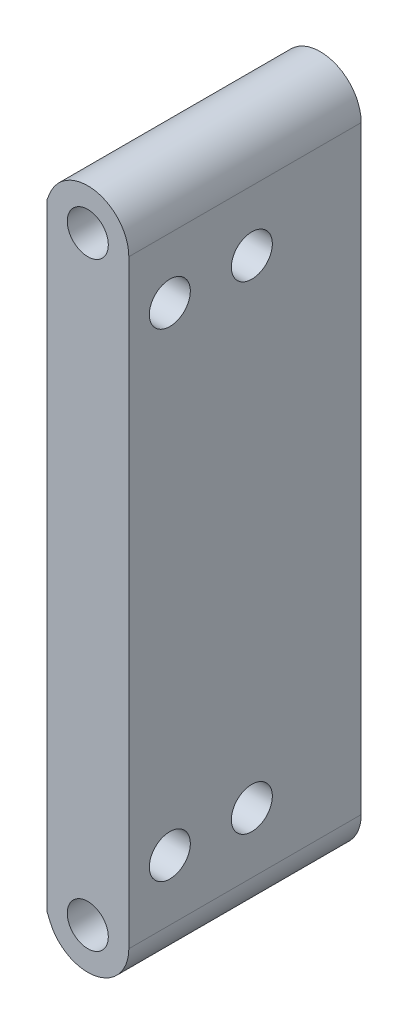
ISO-10303-21;
HEADER;
FILE_DESCRIPTION(('STEP AP214'),'2;1');
FILE_NAME('part.step','',(''),(''),'','','');
FILE_SCHEMA(('AUTOMOTIVE_DESIGN { 1 0 10303 214 1 1 1 1 }'));
ENDSEC;
DATA;
#1=APPLICATION_CONTEXT('core data for automotive mechanical design processes');
#2=APPLICATION_PROTOCOL_DEFINITION('international standard','automotive_design',2000,#1);
#3=PRODUCT_CONTEXT('',#1,'mechanical');
#4=PRODUCT('Part','Part','',(#3));
#5=PRODUCT_RELATED_PRODUCT_CATEGORY('part','',(#4));
#6=PRODUCT_DEFINITION_FORMATION('','',#4);
#7=PRODUCT_DEFINITION_CONTEXT('part definition',#1,'design');
#8=PRODUCT_DEFINITION('design','',#6,#7);
#9=PRODUCT_DEFINITION_SHAPE('','',#8);
#10=(LENGTH_UNIT() NAMED_UNIT(*) SI_UNIT(.MILLI.,.METRE.));
#11=(NAMED_UNIT(*) PLANE_ANGLE_UNIT() SI_UNIT($,.RADIAN.));
#12=(NAMED_UNIT(*) SI_UNIT($,.STERADIAN.) SOLID_ANGLE_UNIT());
#13=UNCERTAINTY_MEASURE_WITH_UNIT(LENGTH_MEASURE(1.E-05),#10,'distance_accuracy_value','');
#14=(GEOMETRIC_REPRESENTATION_CONTEXT(3) GLOBAL_UNCERTAINTY_ASSIGNED_CONTEXT((#13)) GLOBAL_UNIT_ASSIGNED_CONTEXT((#10,
#11,#12)) REPRESENTATION_CONTEXT('',''));
#15=CARTESIAN_POINT('',(0.,0.,0.));
#16=DIRECTION('',(0.,0.,1.));
#17=DIRECTION('',(1.,0.,0.));
#18=AXIS2_PLACEMENT_3D('',#15,#16,#17);
#19=CARTESIAN_POINT('',(-21.920310216783,21.920310216783,17.));
#20=DIRECTION('',(0.,0.,-1.));
#21=DIRECTION('',(-1.,0.,0.));
#22=AXIS2_PLACEMENT_3D('',#19,#20,#21);
#23=PLANE('',#22);
#24=DIRECTION('',(-0.38268343236509,-0.923879532511287,0.));
#25=VECTOR('',#24,1.);
#26=CARTESIAN_POINT('',(-24.6919488143168,23.0683605138782,17.));
#27=LINE('',#26,#25);
#28=CARTESIAN_POINT('',(-24.6919488143168,23.0683605138782,17.));
#29=VERTEX_POINT('',#28);
#30=CARTESIAN_POINT('',(-24.920310216783,22.517047318922,17.));
#31=VERTEX_POINT('',#30);
#32=EDGE_CURVE('E98',#29,#31,#27,.T.);
#33=ORIENTED_EDGE('',*,*,#32,.T.);
#34=DIRECTION('',(0.,1.,0.));
#35=VECTOR('',#34,1.);
#36=CARTESIAN_POINT('',(-24.920310216783,22.517047318922,17.));
#37=LINE('',#36,#35);
#38=CARTESIAN_POINT('',(-24.920310216783,-22.517047318922,17.));
#39=VERTEX_POINT('',#38);
#40=EDGE_CURVE('E116',#39,#31,#37,.T.);
#41=ORIENTED_EDGE('',*,*,#40,.F.);
#42=DIRECTION('',(0.38268343236509,-0.923879532511287,0.));
#43=VECTOR('',#42,1.);
#44=CARTESIAN_POINT('',(-24.6919488143168,-23.0683605138782,17.));
#45=LINE('',#44,#43);
#46=CARTESIAN_POINT('',(-24.6919488143168,-23.0683605138782,17.));
#47=VERTEX_POINT('',#46);
#48=EDGE_CURVE('E152',#39,#47,#45,.T.);
#49=ORIENTED_EDGE('',*,*,#48,.T.);
#50=CARTESIAN_POINT('',(-21.920310216783,-21.920310216783,17.));
#51=DIRECTION('',(0.,0.,1.));
#52=DIRECTION('',(1.,0.,0.));
#53=AXIS2_PLACEMENT_3D('',#50,#51,#52);
#54=CIRCLE('',#53,3.);
#55=CARTESIAN_POINT('',(-18.920310216783,-21.920310216783,17.));
#56=VERTEX_POINT('',#55);
#57=EDGE_CURVE('E156',#47,#56,#54,.T.);
#58=ORIENTED_EDGE('',*,*,#57,.T.);
#59=DIRECTION('',(0.,1.,0.));
#60=VECTOR('',#59,1.);
#61=CARTESIAN_POINT('',(-18.920310216783,-21.920310216783,17.));
#62=LINE('',#61,#60);
#63=CARTESIAN_POINT('',(-18.920310216783,21.920310216783,17.));
#64=VERTEX_POINT('',#63);
#65=EDGE_CURVE('E64',#56,#64,#62,.T.);
#66=ORIENTED_EDGE('',*,*,#65,.T.);
#67=CARTESIAN_POINT('',(-21.920310216783,21.920310216783,17.));
#68=DIRECTION('',(0.,0.,1.));
#69=DIRECTION('',(-1.,0.,0.));
#70=AXIS2_PLACEMENT_3D('',#67,#68,#69);
#71=CIRCLE('',#70,3.);
#72=EDGE_CURVE('E151',#64,#29,#71,.T.);
#73=ORIENTED_EDGE('',*,*,#72,.T.);
#74=EDGE_LOOP('',(#33,#41,#49,#58,#66,#73));
#75=FACE_BOUND('',#74,.T.);
#76=CARTESIAN_POINT('',(-21.920310216783,21.920310216783,17.));
#77=DIRECTION('',(0.,0.,1.));
#78=DIRECTION('',(1.,0.,0.));
#79=AXIS2_PLACEMENT_3D('',#76,#77,#78);
#80=CIRCLE('',#79,1.5);
#81=CARTESIAN_POINT('',(-20.420310216783,21.920310216783,17.));
#82=VERTEX_POINT('',#81);
#83=EDGE_CURVE('E142',#82,#82,#80,.T.);
#84=ORIENTED_EDGE('',*,*,#83,.F.);
#85=EDGE_LOOP('',(#84));
#86=FACE_BOUND('',#85,.T.);
#87=CARTESIAN_POINT('',(-21.920310216783,-21.920310216783,17.));
#88=DIRECTION('',(0.,0.,1.));
#89=DIRECTION('',(1.,0.,0.));
#90=AXIS2_PLACEMENT_3D('',#87,#88,#89);
#91=CIRCLE('',#90,1.5);
#92=CARTESIAN_POINT('',(-20.420310216783,-21.920310216783,17.));
#93=VERTEX_POINT('',#92);
#94=EDGE_CURVE('E134',#93,#93,#91,.T.);
#95=ORIENTED_EDGE('',*,*,#94,.F.);
#96=EDGE_LOOP('',(#95));
#97=FACE_BOUND('',#96,.T.);
#98=ADVANCED_FACE('F39',(#75,#86,#97),#23,.F.);
#99=CARTESIAN_POINT('',(-21.920310216783,21.920310216783,0.));
#100=DIRECTION('',(0.,0.,-1.));
#101=DIRECTION('',(-1.,0.,0.));
#102=AXIS2_PLACEMENT_3D('',#99,#100,#101);
#103=PLANE('',#102);
#104=CARTESIAN_POINT('',(-21.920310216783,21.920310216783,0.));
#105=DIRECTION('',(0.,0.,1.));
#106=DIRECTION('',(1.,0.,0.));
#107=AXIS2_PLACEMENT_3D('',#104,#105,#106);
#108=CIRCLE('',#107,1.5);
#109=CARTESIAN_POINT('',(-20.420310216783,21.920310216783,0.));
#110=VERTEX_POINT('',#109);
#111=EDGE_CURVE('E136',#110,#110,#108,.T.);
#112=ORIENTED_EDGE('',*,*,#111,.T.);
#113=EDGE_LOOP('',(#112));
#114=FACE_BOUND('',#113,.T.);
#115=CARTESIAN_POINT('',(-21.920310216783,21.920310216783,0.));
#116=DIRECTION('',(0.,0.,1.));
#117=DIRECTION('',(-1.,0.,0.));
#118=AXIS2_PLACEMENT_3D('',#115,#116,#117);
#119=CIRCLE('',#118,3.);
#120=CARTESIAN_POINT('',(-18.920310216783,21.920310216783,0.));
#121=VERTEX_POINT('',#120);
#122=CARTESIAN_POINT('',(-24.6919488143168,23.0683605138782,0.));
#123=VERTEX_POINT('',#122);
#124=EDGE_CURVE('E147',#121,#123,#119,.T.);
#125=ORIENTED_EDGE('',*,*,#124,.F.);
#126=DIRECTION('',(0.,1.,0.));
#127=VECTOR('',#126,1.);
#128=CARTESIAN_POINT('',(-18.920310216783,-21.920310216783,0.));
#129=LINE('',#128,#127);
#130=CARTESIAN_POINT('',(-18.920310216783,-21.920310216783,0.));
#131=VERTEX_POINT('',#130);
#132=EDGE_CURVE('E93',#131,#121,#129,.T.);
#133=ORIENTED_EDGE('',*,*,#132,.F.);
#134=CARTESIAN_POINT('',(-21.920310216783,-21.920310216783,0.));
#135=DIRECTION('',(0.,0.,1.));
#136=DIRECTION('',(1.,0.,0.));
#137=AXIS2_PLACEMENT_3D('',#134,#135,#136);
#138=CIRCLE('',#137,3.);
#139=CARTESIAN_POINT('',(-24.6919488143168,-23.0683605138782,0.));
#140=VERTEX_POINT('',#139);
#141=EDGE_CURVE('E166',#140,#131,#138,.T.);
#142=ORIENTED_EDGE('',*,*,#141,.F.);
#143=DIRECTION('',(0.38268343236509,-0.923879532511287,0.));
#144=VECTOR('',#143,1.);
#145=CARTESIAN_POINT('',(-24.6919488143168,-23.0683605138782,0.));
#146=LINE('',#145,#144);
#147=CARTESIAN_POINT('',(-33.7716385975339,-1.14805029709527,0.));
#148=VERTEX_POINT('',#147);
#149=EDGE_CURVE('E170',#148,#140,#146,.T.);
#150=ORIENTED_EDGE('',*,*,#149,.F.);
#151=CARTESIAN_POINT('',(-31.,0.,0.));
#152=DIRECTION('',(0.,0.,1.));
#153=DIRECTION('',(1.,0.,0.));
#154=AXIS2_PLACEMENT_3D('',#151,#152,#153);
#155=CIRCLE('',#154,3.);
#156=CARTESIAN_POINT('',(-33.7716385975339,1.14805029709527,0.));
#157=VERTEX_POINT('',#156);
#158=EDGE_CURVE('E163',#157,#148,#155,.T.);
#159=ORIENTED_EDGE('',*,*,#158,.F.);
#160=DIRECTION('',(-0.38268343236509,-0.923879532511287,0.));
#161=VECTOR('',#160,1.);
#162=CARTESIAN_POINT('',(-24.6919488143168,23.0683605138782,0.));
#163=LINE('',#162,#161);
#164=EDGE_CURVE('E165',#123,#157,#163,.T.);
#165=ORIENTED_EDGE('',*,*,#164,.F.);
#166=EDGE_LOOP('',(#125,#133,#142,#150,#159,#165));
#167=FACE_BOUND('',#166,.T.);
#168=CARTESIAN_POINT('',(-31.,0.,0.));
#169=DIRECTION('',(0.,0.,1.));
#170=DIRECTION('',(1.,0.,0.));
#171=AXIS2_PLACEMENT_3D('',#168,#169,#170);
#172=CIRCLE('',#171,1.5);
#173=CARTESIAN_POINT('',(-29.5,0.,0.));
#174=VERTEX_POINT('',#173);
#175=EDGE_CURVE('E144',#174,#174,#172,.T.);
#176=ORIENTED_EDGE('',*,*,#175,.T.);
#177=EDGE_LOOP('',(#176));
#178=FACE_BOUND('',#177,.T.);
#179=CARTESIAN_POINT('',(-21.920310216783,-21.920310216783,0.));
#180=DIRECTION('',(0.,0.,1.));
#181=DIRECTION('',(1.,0.,0.));
#182=AXIS2_PLACEMENT_3D('',#179,#180,#181);
#183=CIRCLE('',#182,1.5);
#184=CARTESIAN_POINT('',(-20.420310216783,-21.920310216783,0.));
#185=VERTEX_POINT('',#184);
#186=EDGE_CURVE('E132',#185,#185,#183,.T.);
#187=ORIENTED_EDGE('',*,*,#186,.T.);
#188=EDGE_LOOP('',(#187));
#189=FACE_BOUND('',#188,.T.);
#190=ADVANCED_FACE('F188',(#114,#167,#178,#189),#103,.T.);
#191=CARTESIAN_POINT('',(-21.920310216783,21.920310216783,17.));
#192=DIRECTION('',(0.,0.,-1.));
#193=DIRECTION('',(-1.,0.,0.));
#194=AXIS2_PLACEMENT_3D('',#191,#192,#193);
#195=CYLINDRICAL_SURFACE('',#194,3.);
#196=ORIENTED_EDGE('',*,*,#124,.T.);
#197=DIRECTION('',(0.,0.,-1.));
#198=VECTOR('',#197,1.);
#199=CARTESIAN_POINT('',(-24.6919488143168,23.0683605138782,17.));
#200=LINE('',#199,#198);
#201=EDGE_CURVE('E11',#29,#123,#200,.T.);
#202=ORIENTED_EDGE('',*,*,#201,.F.);
#203=ORIENTED_EDGE('',*,*,#72,.F.);
#204=DIRECTION('',(0.,0.,-1.));
#205=VECTOR('',#204,1.);
#206=CARTESIAN_POINT('',(-18.920310216783,21.920310216783,17.));
#207=LINE('',#206,#205);
#208=EDGE_CURVE('E157',#64,#121,#207,.T.);
#209=ORIENTED_EDGE('',*,*,#208,.T.);
#210=EDGE_LOOP('',(#196,#202,#203,#209));
#211=FACE_BOUND('',#210,.T.);
#212=ADVANCED_FACE('F41',(#211),#195,.T.);
#213=CARTESIAN_POINT('',(-24.6919488143168,23.0683605138782,17.));
#214=DIRECTION('',(0.923879532511287,-0.38268343236509,0.));
#215=DIRECTION('',(0.38268343236509,0.923879532511287,0.));
#216=AXIS2_PLACEMENT_3D('',#213,#214,#215);
#217=PLANE('',#216);
#218=DIRECTION('',(0.38268343236509,0.923879532511287,0.));
#219=VECTOR('',#218,1.);
#220=CARTESIAN_POINT('',(-24.6919488143168,23.0683605138782,5.));
#221=LINE('',#220,#219);
#222=CARTESIAN_POINT('',(-33.7716385975339,1.14805029709527,5.));
#223=VERTEX_POINT('',#222);
#224=CARTESIAN_POINT('',(-24.920310216783,22.517047318922,5.));
#225=VERTEX_POINT('',#224);
#226=EDGE_CURVE('E121',#223,#225,#221,.T.);
#227=ORIENTED_EDGE('',*,*,#226,.T.);
#228=DIRECTION('',(0.,0.,1.));
#229=VECTOR('',#228,1.);
#230=CARTESIAN_POINT('',(-24.920310216783,22.517047318922,5.));
#231=LINE('',#230,#229);
#232=EDGE_CURVE('E111',#225,#31,#231,.T.);
#233=ORIENTED_EDGE('',*,*,#232,.T.);
#234=ORIENTED_EDGE('',*,*,#32,.F.);
#235=ORIENTED_EDGE('',*,*,#201,.T.);
#236=ORIENTED_EDGE('',*,*,#164,.T.);
#237=DIRECTION('',(0.,0.,-1.));
#238=VECTOR('',#237,1.);
#239=CARTESIAN_POINT('',(-33.7716385975339,1.14805029709527,17.));
#240=LINE('',#239,#238);
#241=EDGE_CURVE('E48',#223,#157,#240,.T.);
#242=ORIENTED_EDGE('',*,*,#241,.F.);
#243=EDGE_LOOP('',(#227,#233,#234,#235,#236,#242));
#244=FACE_BOUND('',#243,.T.);
#245=ADVANCED_FACE('F129',(#244),#217,.F.);
#246=CARTESIAN_POINT('',(-31.,0.,17.));
#247=DIRECTION('',(0.,0.,-1.));
#248=DIRECTION('',(-1.,0.,0.));
#249=AXIS2_PLACEMENT_3D('',#246,#247,#248);
#250=CYLINDRICAL_SURFACE('',#249,3.);
#251=DIRECTION('',(0.,0.,-1.));
#252=VECTOR('',#251,1.);
#253=CARTESIAN_POINT('',(-33.7716385975339,-1.14805029709527,17.));
#254=LINE('',#253,#252);
#255=CARTESIAN_POINT('',(-33.7716385975339,-1.14805029709527,5.));
#256=VERTEX_POINT('',#255);
#257=EDGE_CURVE('E178',#256,#148,#254,.T.);
#258=ORIENTED_EDGE('',*,*,#257,.F.);
#259=CARTESIAN_POINT('',(-31.,0.,5.));
#260=DIRECTION('',(0.,0.,-1.));
#261=DIRECTION('',(-1.,0.,0.));
#262=AXIS2_PLACEMENT_3D('',#259,#260,#261);
#263=CIRCLE('',#262,3.);
#264=EDGE_CURVE('E54',#256,#223,#263,.T.);
#265=ORIENTED_EDGE('',*,*,#264,.T.);
#266=ORIENTED_EDGE('',*,*,#241,.T.);
#267=ORIENTED_EDGE('',*,*,#158,.T.);
#268=EDGE_LOOP('',(#258,#265,#266,#267));
#269=FACE_BOUND('',#268,.T.);
#270=ADVANCED_FACE('F185',(#269),#250,.T.);
#271=CARTESIAN_POINT('',(-24.6919488143168,-23.0683605138782,17.));
#272=DIRECTION('',(0.923879532511287,0.38268343236509,0.));
#273=DIRECTION('',(-0.38268343236509,0.923879532511287,0.));
#274=AXIS2_PLACEMENT_3D('',#271,#272,#273);
#275=PLANE('',#274);
#276=ORIENTED_EDGE('',*,*,#48,.F.);
#277=DIRECTION('',(0.,0.,1.));
#278=VECTOR('',#277,1.);
#279=CARTESIAN_POINT('',(-24.920310216783,-22.517047318922,5.));
#280=LINE('',#279,#278);
#281=CARTESIAN_POINT('',(-24.920310216783,-22.517047318922,5.));
#282=VERTEX_POINT('',#281);
#283=EDGE_CURVE('E125',#282,#39,#280,.T.);
#284=ORIENTED_EDGE('',*,*,#283,.F.);
#285=DIRECTION('',(-0.38268343236509,0.923879532511287,0.));
#286=VECTOR('',#285,1.);
#287=CARTESIAN_POINT('',(-24.6919488143168,-23.0683605138782,5.));
#288=LINE('',#287,#286);
#289=EDGE_CURVE('E127',#282,#256,#288,.T.);
#290=ORIENTED_EDGE('',*,*,#289,.T.);
#291=ORIENTED_EDGE('',*,*,#257,.T.);
#292=ORIENTED_EDGE('',*,*,#149,.T.);
#293=DIRECTION('',(0.,0.,-1.));
#294=VECTOR('',#293,1.);
#295=CARTESIAN_POINT('',(-24.6919488143168,-23.0683605138782,17.));
#296=LINE('',#295,#294);
#297=EDGE_CURVE('E171',#47,#140,#296,.T.);
#298=ORIENTED_EDGE('',*,*,#297,.F.);
#299=EDGE_LOOP('',(#276,#284,#290,#291,#292,#298));
#300=FACE_BOUND('',#299,.T.);
#301=ADVANCED_FACE('F194',(#300),#275,.F.);
#302=CARTESIAN_POINT('',(-21.920310216783,-21.920310216783,17.));
#303=DIRECTION('',(0.,0.,-1.));
#304=DIRECTION('',(-1.,0.,0.));
#305=AXIS2_PLACEMENT_3D('',#302,#303,#304);
#306=CYLINDRICAL_SURFACE('',#305,3.);
#307=ORIENTED_EDGE('',*,*,#141,.T.);
#308=DIRECTION('',(0.,0.,-1.));
#309=VECTOR('',#308,1.);
#310=CARTESIAN_POINT('',(-18.920310216783,-21.920310216783,17.));
#311=LINE('',#310,#309);
#312=EDGE_CURVE('E173',#56,#131,#311,.T.);
#313=ORIENTED_EDGE('',*,*,#312,.F.);
#314=ORIENTED_EDGE('',*,*,#57,.F.);
#315=ORIENTED_EDGE('',*,*,#297,.T.);
#316=EDGE_LOOP('',(#307,#313,#314,#315));
#317=FACE_BOUND('',#316,.T.);
#318=ADVANCED_FACE('F197',(#317),#306,.T.);
#319=CARTESIAN_POINT('',(-18.920310216783,-21.920310216783,17.));
#320=DIRECTION('',(-1.,0.,0.));
#321=DIRECTION('',(0.,0.,1.));
#322=AXIS2_PLACEMENT_3D('',#319,#320,#321);
#323=PLANE('',#322);
#324=CARTESIAN_POINT('',(-18.920310216783,-17.5,8.00000000000001));
#325=DIRECTION('',(-1.,0.,0.));
#326=DIRECTION('',(0.,1.,0.));
#327=AXIS2_PLACEMENT_3D('',#324,#325,#326);
#328=CIRCLE('',#327,1.5);
#329=CARTESIAN_POINT('',(-18.920310216783,-16.,8.00000000000001));
#330=VERTEX_POINT('',#329);
#331=EDGE_CURVE('E212',#330,#330,#328,.T.);
#332=ORIENTED_EDGE('',*,*,#331,.T.);
#333=EDGE_LOOP('',(#332));
#334=FACE_BOUND('',#333,.T.);
#335=CARTESIAN_POINT('',(-18.920310216783,-17.5,14.));
#336=DIRECTION('',(-1.,0.,0.));
#337=DIRECTION('',(0.,-1.,0.));
#338=AXIS2_PLACEMENT_3D('',#335,#336,#337);
#339=CIRCLE('',#338,1.5);
#340=CARTESIAN_POINT('',(-18.920310216783,-19.,14.));
#341=VERTEX_POINT('',#340);
#342=EDGE_CURVE('E219',#341,#341,#339,.T.);
#343=ORIENTED_EDGE('',*,*,#342,.T.);
#344=EDGE_LOOP('',(#343));
#345=FACE_BOUND('',#344,.T.);
#346=CARTESIAN_POINT('',(-18.920310216783,17.5,14.));
#347=DIRECTION('',(-1.,0.,0.));
#348=DIRECTION('',(0.,1.,0.));
#349=AXIS2_PLACEMENT_3D('',#346,#347,#348);
#350=CIRCLE('',#349,1.5);
#351=CARTESIAN_POINT('',(-18.920310216783,19.,14.));
#352=VERTEX_POINT('',#351);
#353=EDGE_CURVE('E208',#352,#352,#350,.T.);
#354=ORIENTED_EDGE('',*,*,#353,.T.);
#355=EDGE_LOOP('',(#354));
#356=FACE_BOUND('',#355,.T.);
#357=CARTESIAN_POINT('',(-18.920310216783,17.5,8.));
#358=DIRECTION('',(-1.,0.,0.));
#359=DIRECTION('',(0.,-1.,0.));
#360=AXIS2_PLACEMENT_3D('',#357,#358,#359);
#361=CIRCLE('',#360,1.5);
#362=CARTESIAN_POINT('',(-18.920310216783,16.,8.));
#363=VERTEX_POINT('',#362);
#364=EDGE_CURVE('E201',#363,#363,#361,.T.);
#365=ORIENTED_EDGE('',*,*,#364,.T.);
#366=EDGE_LOOP('',(#365));
#367=FACE_BOUND('',#366,.T.);
#368=ORIENTED_EDGE('',*,*,#132,.T.);
#369=ORIENTED_EDGE('',*,*,#208,.F.);
#370=ORIENTED_EDGE('',*,*,#65,.F.);
#371=ORIENTED_EDGE('',*,*,#312,.T.);
#372=EDGE_LOOP('',(#368,#369,#370,#371));
#373=FACE_BOUND('',#372,.T.);
#374=ADVANCED_FACE('F229',(#334,#345,#356,#367,#373),#323,.F.);
#375=CARTESIAN_POINT('',(-31.,0.,17.));
#376=DIRECTION('',(0.,0.,-1.));
#377=DIRECTION('',(-1.,0.,0.));
#378=AXIS2_PLACEMENT_3D('',#375,#376,#377);
#379=CYLINDRICAL_SURFACE('',#378,1.5);
#380=CARTESIAN_POINT('',(-31.,0.,5.));
#381=DIRECTION('',(0.,0.,-1.));
#382=DIRECTION('',(-1.,0.,0.));
#383=AXIS2_PLACEMENT_3D('',#380,#381,#382);
#384=CIRCLE('',#383,1.5);
#385=CARTESIAN_POINT('',(-32.5,0.,5.));
#386=VERTEX_POINT('',#385);
#387=EDGE_CURVE('E43',#386,#386,#384,.T.);
#388=ORIENTED_EDGE('',*,*,#387,.F.);
#389=EDGE_LOOP('',(#388));
#390=FACE_BOUND('',#389,.T.);
#391=ORIENTED_EDGE('',*,*,#175,.F.);
#392=EDGE_LOOP('',(#391));
#393=FACE_BOUND('',#392,.T.);
#394=ADVANCED_FACE('F262',(#390,#393),#379,.F.);
#395=CARTESIAN_POINT('',(-21.920310216783,21.920310216783,17.));
#396=DIRECTION('',(0.,0.,-1.));
#397=DIRECTION('',(-1.,0.,0.));
#398=AXIS2_PLACEMENT_3D('',#395,#396,#397);
#399=CYLINDRICAL_SURFACE('',#398,1.5);
#400=ORIENTED_EDGE('',*,*,#83,.T.);
#401=EDGE_LOOP('',(#400));
#402=FACE_BOUND('',#401,.T.);
#403=ORIENTED_EDGE('',*,*,#111,.F.);
#404=EDGE_LOOP('',(#403));
#405=FACE_BOUND('',#404,.T.);
#406=ADVANCED_FACE('F291',(#402,#405),#399,.F.);
#407=CARTESIAN_POINT('',(-21.920310216783,-21.920310216783,17.));
#408=DIRECTION('',(0.,0.,-1.));
#409=DIRECTION('',(-1.,0.,0.));
#410=AXIS2_PLACEMENT_3D('',#407,#408,#409);
#411=CYLINDRICAL_SURFACE('',#410,1.5);
#412=ORIENTED_EDGE('',*,*,#94,.T.);
#413=EDGE_LOOP('',(#412));
#414=FACE_BOUND('',#413,.T.);
#415=ORIENTED_EDGE('',*,*,#186,.F.);
#416=EDGE_LOOP('',(#415));
#417=FACE_BOUND('',#416,.T.);
#418=ADVANCED_FACE('F297',(#414,#417),#411,.F.);
#419=CARTESIAN_POINT('',(0.,0.,5.));
#420=DIRECTION('',(0.,0.,-1.));
#421=DIRECTION('',(-1.,0.,0.));
#422=AXIS2_PLACEMENT_3D('',#419,#420,#421);
#423=PLANE('',#422);
#424=ORIENTED_EDGE('',*,*,#387,.T.);
#425=EDGE_LOOP('',(#424));
#426=FACE_BOUND('',#425,.T.);
#427=ORIENTED_EDGE('',*,*,#264,.F.);
#428=ORIENTED_EDGE('',*,*,#289,.F.);
#429=DIRECTION('',(0.,1.,0.));
#430=VECTOR('',#429,1.);
#431=CARTESIAN_POINT('',(-24.920310216783,22.517047318922,5.));
#432=LINE('',#431,#430);
#433=EDGE_CURVE('E120',#282,#225,#432,.T.);
#434=ORIENTED_EDGE('',*,*,#433,.T.);
#435=ORIENTED_EDGE('',*,*,#226,.F.);
#436=EDGE_LOOP('',(#427,#428,#434,#435));
#437=FACE_BOUND('',#436,.T.);
#438=ADVANCED_FACE('F124',(#426,#437),#423,.F.);
#439=CARTESIAN_POINT('',(-24.920310216783,22.517047318922,5.));
#440=DIRECTION('',(1.,0.,0.));
#441=DIRECTION('',(0.,1.,0.));
#442=AXIS2_PLACEMENT_3D('',#439,#440,#441);
#443=PLANE('',#442);
#444=CARTESIAN_POINT('',(-24.920310216783,-17.5,8.00000000000001));
#445=DIRECTION('',(-1.,0.,0.));
#446=DIRECTION('',(0.,1.,0.));
#447=AXIS2_PLACEMENT_3D('',#444,#445,#446);
#448=CIRCLE('',#447,1.5);
#449=CARTESIAN_POINT('',(-24.920310216783,-16.,8.00000000000001));
#450=VERTEX_POINT('',#449);
#451=EDGE_CURVE('E211',#450,#450,#448,.T.);
#452=ORIENTED_EDGE('',*,*,#451,.F.);
#453=EDGE_LOOP('',(#452));
#454=FACE_BOUND('',#453,.T.);
#455=CARTESIAN_POINT('',(-24.920310216783,-17.5,14.));
#456=DIRECTION('',(-1.,0.,0.));
#457=DIRECTION('',(0.,-1.,0.));
#458=AXIS2_PLACEMENT_3D('',#455,#456,#457);
#459=CIRCLE('',#458,1.5);
#460=CARTESIAN_POINT('',(-24.920310216783,-19.,14.));
#461=VERTEX_POINT('',#460);
#462=EDGE_CURVE('E220',#461,#461,#459,.T.);
#463=ORIENTED_EDGE('',*,*,#462,.F.);
#464=EDGE_LOOP('',(#463));
#465=FACE_BOUND('',#464,.T.);
#466=CARTESIAN_POINT('',(-24.920310216783,17.5,14.));
#467=DIRECTION('',(-1.,0.,0.));
#468=DIRECTION('',(0.,1.,0.));
#469=AXIS2_PLACEMENT_3D('',#466,#467,#468);
#470=CIRCLE('',#469,1.5);
#471=CARTESIAN_POINT('',(-24.920310216783,19.,14.));
#472=VERTEX_POINT('',#471);
#473=EDGE_CURVE('E224',#472,#472,#470,.T.);
#474=ORIENTED_EDGE('',*,*,#473,.F.);
#475=EDGE_LOOP('',(#474));
#476=FACE_BOUND('',#475,.T.);
#477=CARTESIAN_POINT('',(-24.920310216783,17.5,8.));
#478=DIRECTION('',(-1.,0.,0.));
#479=DIRECTION('',(0.,-1.,0.));
#480=AXIS2_PLACEMENT_3D('',#477,#478,#479);
#481=CIRCLE('',#480,1.5);
#482=CARTESIAN_POINT('',(-24.920310216783,16.,8.));
#483=VERTEX_POINT('',#482);
#484=EDGE_CURVE('E202',#483,#483,#481,.T.);
#485=ORIENTED_EDGE('',*,*,#484,.F.);
#486=EDGE_LOOP('',(#485));
#487=FACE_BOUND('',#486,.T.);
#488=ORIENTED_EDGE('',*,*,#40,.T.);
#489=ORIENTED_EDGE('',*,*,#232,.F.);
#490=ORIENTED_EDGE('',*,*,#433,.F.);
#491=ORIENTED_EDGE('',*,*,#283,.T.);
#492=EDGE_LOOP('',(#488,#489,#490,#491));
#493=FACE_BOUND('',#492,.T.);
#494=ADVANCED_FACE('F117',(#454,#465,#476,#487,#493),#443,.F.);
#495=CARTESIAN_POINT('',(-18.920310216783,17.5,8.));
#496=DIRECTION('',(-1.,0.,0.));
#497=DIRECTION('',(0.,-1.,0.));
#498=AXIS2_PLACEMENT_3D('',#495,#496,#497);
#499=CYLINDRICAL_SURFACE('',#498,1.5);
#500=ORIENTED_EDGE('',*,*,#364,.F.);
#501=EDGE_LOOP('',(#500));
#502=FACE_BOUND('',#501,.T.);
#503=ORIENTED_EDGE('',*,*,#484,.T.);
#504=EDGE_LOOP('',(#503));
#505=FACE_BOUND('',#504,.T.);
#506=ADVANCED_FACE('F237',(#502,#505),#499,.F.);
#507=CARTESIAN_POINT('',(-18.920310216783,17.5,14.));
#508=DIRECTION('',(-1.,0.,0.));
#509=DIRECTION('',(0.,-1.,0.));
#510=AXIS2_PLACEMENT_3D('',#507,#508,#509);
#511=CYLINDRICAL_SURFACE('',#510,1.5);
#512=ORIENTED_EDGE('',*,*,#353,.F.);
#513=EDGE_LOOP('',(#512));
#514=FACE_BOUND('',#513,.T.);
#515=ORIENTED_EDGE('',*,*,#473,.T.);
#516=EDGE_LOOP('',(#515));
#517=FACE_BOUND('',#516,.T.);
#518=ADVANCED_FACE('F235',(#514,#517),#511,.F.);
#519=CARTESIAN_POINT('',(-18.920310216783,-17.5,14.));
#520=DIRECTION('',(-1.,0.,0.));
#521=DIRECTION('',(0.,-1.,0.));
#522=AXIS2_PLACEMENT_3D('',#519,#520,#521);
#523=CYLINDRICAL_SURFACE('',#522,1.5);
#524=ORIENTED_EDGE('',*,*,#342,.F.);
#525=EDGE_LOOP('',(#524));
#526=FACE_BOUND('',#525,.T.);
#527=ORIENTED_EDGE('',*,*,#462,.T.);
#528=EDGE_LOOP('',(#527));
#529=FACE_BOUND('',#528,.T.);
#530=ADVANCED_FACE('F231',(#526,#529),#523,.F.);
#531=CARTESIAN_POINT('',(-18.920310216783,-17.5,8.00000000000001));
#532=DIRECTION('',(-1.,0.,0.));
#533=DIRECTION('',(0.,-1.,0.));
#534=AXIS2_PLACEMENT_3D('',#531,#532,#533);
#535=CYLINDRICAL_SURFACE('',#534,1.5);
#536=ORIENTED_EDGE('',*,*,#331,.F.);
#537=EDGE_LOOP('',(#536));
#538=FACE_BOUND('',#537,.T.);
#539=ORIENTED_EDGE('',*,*,#451,.T.);
#540=EDGE_LOOP('',(#539));
#541=FACE_BOUND('',#540,.T.);
#542=ADVANCED_FACE('F328',(#538,#541),#535,.F.);
#543=CLOSED_SHELL('',(#98,#190,#212,#245,#270,#301,#318,#374,#394,#406,#418,#438,#494,#506,#518,
#530,#542));
#544=MANIFOLD_SOLID_BREP('B2',#543);
#545=ADVANCED_BREP_SHAPE_REPRESENTATION('',(#18,#544),#14);
#546=SHAPE_DEFINITION_REPRESENTATION(#9,#545);
ENDSEC;
END-ISO-10303-21;
